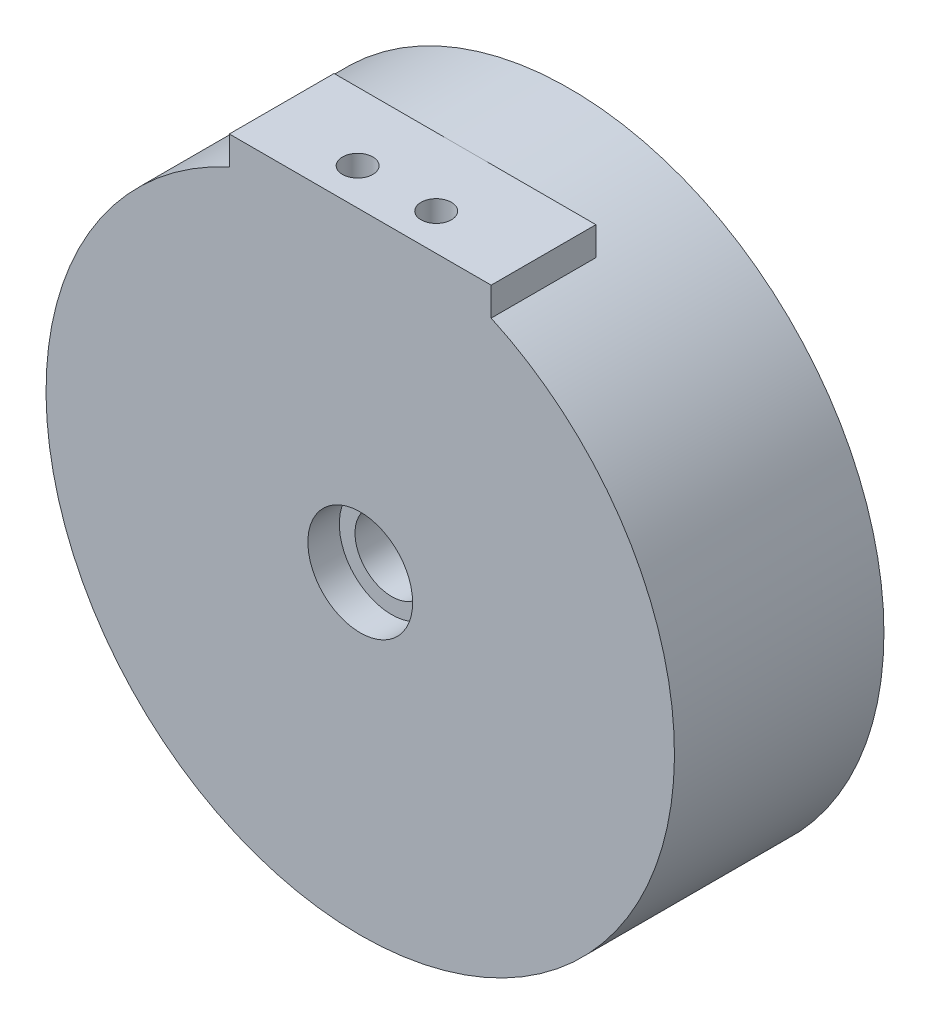
ISO-10303-21;
HEADER;
FILE_DESCRIPTION(('STEP AP214'),'2;1');
FILE_NAME('part.step','',(''),(''),'','','');
FILE_SCHEMA(('AUTOMOTIVE_DESIGN { 1 0 10303 214 1 1 1 1 }'));
ENDSEC;
DATA;
#1=APPLICATION_CONTEXT('core data for automotive mechanical design processes');
#2=APPLICATION_PROTOCOL_DEFINITION('international standard','automotive_design',2000,#1);
#3=PRODUCT_CONTEXT('',#1,'mechanical');
#4=PRODUCT('Part','Part','',(#3));
#5=PRODUCT_RELATED_PRODUCT_CATEGORY('part','',(#4));
#6=PRODUCT_DEFINITION_FORMATION('','',#4);
#7=PRODUCT_DEFINITION_CONTEXT('part definition',#1,'design');
#8=PRODUCT_DEFINITION('design','',#6,#7);
#9=PRODUCT_DEFINITION_SHAPE('','',#8);
#10=(LENGTH_UNIT() NAMED_UNIT(*) SI_UNIT(.MILLI.,.METRE.));
#11=(NAMED_UNIT(*) PLANE_ANGLE_UNIT() SI_UNIT($,.RADIAN.));
#12=(NAMED_UNIT(*) SI_UNIT($,.STERADIAN.) SOLID_ANGLE_UNIT());
#13=UNCERTAINTY_MEASURE_WITH_UNIT(LENGTH_MEASURE(1.E-05),#10,'distance_accuracy_value','');
#14=(GEOMETRIC_REPRESENTATION_CONTEXT(3) GLOBAL_UNCERTAINTY_ASSIGNED_CONTEXT((#13)) GLOBAL_UNIT_ASSIGNED_CONTEXT((#10,
#11,#12)) REPRESENTATION_CONTEXT('',''));
#15=CARTESIAN_POINT('',(0.,0.,0.));
#16=DIRECTION('',(0.,0.,1.));
#17=DIRECTION('',(1.,0.,0.));
#18=AXIS2_PLACEMENT_3D('',#15,#16,#17);
#19=CARTESIAN_POINT('',(0.,0.,0.));
#20=DIRECTION('',(0.,0.,1.));
#21=DIRECTION('',(1.,0.,0.));
#22=AXIS2_PLACEMENT_3D('',#19,#20,#21);
#23=CYLINDRICAL_SURFACE('',#22,3.5);
#24=CARTESIAN_POINT('',(0.,0.,0.));
#25=DIRECTION('',(0.,0.,1.));
#26=DIRECTION('',(1.,0.,0.));
#27=AXIS2_PLACEMENT_3D('',#24,#25,#26);
#28=CIRCLE('',#27,3.5);
#29=CARTESIAN_POINT('',(3.5,0.,0.));
#30=VERTEX_POINT('',#29);
#31=EDGE_CURVE('E232',#30,#30,#28,.T.);
#32=ORIENTED_EDGE('',*,*,#31,.F.);
#33=EDGE_LOOP('',(#32));
#34=FACE_BOUND('',#33,.T.);
#35=CARTESIAN_POINT('',(0.,0.,17.));
#36=DIRECTION('',(0.,0.,1.));
#37=DIRECTION('',(1.,0.,0.));
#38=AXIS2_PLACEMENT_3D('',#35,#36,#37);
#39=CIRCLE('',#38,3.5);
#40=CARTESIAN_POINT('',(3.5,0.,17.));
#41=VERTEX_POINT('',#40);
#42=EDGE_CURVE('E98',#41,#41,#39,.F.);
#43=ORIENTED_EDGE('',*,*,#42,.F.);
#44=EDGE_LOOP('',(#43));
#45=FACE_BOUND('',#44,.T.);
#46=ADVANCED_FACE('F94',(#34,#45),#23,.F.);
#47=CARTESIAN_POINT('',(0.,0.,0.));
#48=DIRECTION('',(0.,0.,1.));
#49=DIRECTION('',(1.,0.,0.));
#50=AXIS2_PLACEMENT_3D('',#47,#48,#49);
#51=PLANE('',#50);
#52=ORIENTED_EDGE('',*,*,#31,.T.);
#53=EDGE_LOOP('',(#52));
#54=FACE_BOUND('',#53,.T.);
#55=CARTESIAN_POINT('',(0.,0.,0.));
#56=DIRECTION('',(0.,0.,1.));
#57=DIRECTION('',(1.,0.,0.));
#58=AXIS2_PLACEMENT_3D('',#55,#56,#57);
#59=CIRCLE('',#58,30.);
#60=CARTESIAN_POINT('',(30.,0.,0.));
#61=VERTEX_POINT('',#60);
#62=EDGE_CURVE('E103',#61,#61,#59,.T.);
#63=ORIENTED_EDGE('',*,*,#62,.F.);
#64=EDGE_LOOP('',(#63));
#65=FACE_BOUND('',#64,.T.);
#66=ADVANCED_FACE('F170',(#54,#65),#51,.F.);
#67=CARTESIAN_POINT('',(0.,30.,10.));
#68=DIRECTION('',(0.,-1.,0.));
#69=DIRECTION('',(0.,0.,-1.));
#70=AXIS2_PLACEMENT_3D('',#67,#68,#69);
#71=PLANE('',#70);
#72=CARTESIAN_POINT('',(-3.75,30.,16.5));
#73=DIRECTION('',(0.,1.,0.));
#74=DIRECTION('',(0.,0.,1.));
#75=AXIS2_PLACEMENT_3D('',#72,#73,#74);
#76=CIRCLE('',#75,1.45);
#77=CARTESIAN_POINT('',(-3.75,30.,17.95));
#78=VERTEX_POINT('',#77);
#79=EDGE_CURVE('E243',#78,#78,#76,.T.);
#80=ORIENTED_EDGE('',*,*,#79,.F.);
#81=EDGE_LOOP('',(#80));
#82=FACE_BOUND('',#81,.T.);
#83=CARTESIAN_POINT('',(3.75,30.,16.5));
#84=DIRECTION('',(0.,1.,0.));
#85=DIRECTION('',(0.,0.,1.));
#86=AXIS2_PLACEMENT_3D('',#83,#84,#85);
#87=CIRCLE('',#86,1.45);
#88=CARTESIAN_POINT('',(3.75,30.,17.95));
#89=VERTEX_POINT('',#88);
#90=EDGE_CURVE('E246',#89,#89,#87,.T.);
#91=ORIENTED_EDGE('',*,*,#90,.F.);
#92=EDGE_LOOP('',(#91));
#93=FACE_BOUND('',#92,.T.);
#94=DIRECTION('',(1.,0.,0.));
#95=VECTOR('',#94,1.);
#96=CARTESIAN_POINT('',(0.,30.,10.));
#97=LINE('',#96,#95);
#98=CARTESIAN_POINT('',(-12.5,30.,10.));
#99=VERTEX_POINT('',#98);
#100=CARTESIAN_POINT('',(0.,30.,10.));
#101=VERTEX_POINT('',#100);
#102=EDGE_CURVE('E142',#99,#101,#97,.T.);
#103=ORIENTED_EDGE('',*,*,#102,.F.);
#104=DIRECTION('',(0.,0.,-1.));
#105=VECTOR('',#104,1.);
#106=CARTESIAN_POINT('',(-12.5,30.,10.));
#107=LINE('',#106,#105);
#108=CARTESIAN_POINT('',(-12.5,30.,20.));
#109=VERTEX_POINT('',#108);
#110=EDGE_CURVE('E149',#109,#99,#107,.T.);
#111=ORIENTED_EDGE('',*,*,#110,.F.);
#112=DIRECTION('',(-1.,0.,0.));
#113=VECTOR('',#112,1.);
#114=CARTESIAN_POINT('',(0.,30.,20.));
#115=LINE('',#114,#113);
#116=CARTESIAN_POINT('',(12.5,30.,20.));
#117=VERTEX_POINT('',#116);
#118=EDGE_CURVE('E259',#117,#109,#115,.T.);
#119=ORIENTED_EDGE('',*,*,#118,.F.);
#120=DIRECTION('',(0.,0.,-1.));
#121=VECTOR('',#120,1.);
#122=CARTESIAN_POINT('',(12.5,30.,10.));
#123=LINE('',#122,#121);
#124=CARTESIAN_POINT('',(12.5,30.,10.));
#125=VERTEX_POINT('',#124);
#126=EDGE_CURVE('E163',#117,#125,#123,.T.);
#127=ORIENTED_EDGE('',*,*,#126,.T.);
#128=DIRECTION('',(1.,0.,0.));
#129=VECTOR('',#128,1.);
#130=CARTESIAN_POINT('',(0.,30.,10.));
#131=LINE('',#130,#129);
#132=EDGE_CURVE('E119',#101,#125,#131,.T.);
#133=ORIENTED_EDGE('',*,*,#132,.F.);
#134=EDGE_LOOP('',(#103,#111,#119,#127,#133));
#135=FACE_BOUND('',#134,.T.);
#136=ADVANCED_FACE('F148',(#82,#93,#135),#71,.F.);
#137=CARTESIAN_POINT('',(-12.5,0.,10.));
#138=DIRECTION('',(1.,0.,0.));
#139=DIRECTION('',(0.,0.,-1.));
#140=AXIS2_PLACEMENT_3D('',#137,#138,#139);
#141=PLANE('',#140);
#142=DIRECTION('',(0.,1.,0.));
#143=VECTOR('',#142,1.);
#144=CARTESIAN_POINT('',(-12.5,0.,10.));
#145=LINE('',#144,#143);
#146=CARTESIAN_POINT('',(-12.5,27.2717802865893,10.));
#147=VERTEX_POINT('',#146);
#148=EDGE_CURVE('E139',#147,#99,#145,.T.);
#149=ORIENTED_EDGE('',*,*,#148,.F.);
#150=DIRECTION('',(0.,0.,-1.));
#151=VECTOR('',#150,1.);
#152=CARTESIAN_POINT('',(-12.5,27.2717802865893,10.));
#153=LINE('',#152,#151);
#154=CARTESIAN_POINT('',(-12.5,27.2717802865893,20.));
#155=VERTEX_POINT('',#154);
#156=EDGE_CURVE('E158',#155,#147,#153,.T.);
#157=ORIENTED_EDGE('',*,*,#156,.F.);
#158=DIRECTION('',(0.,-1.,0.));
#159=VECTOR('',#158,1.);
#160=CARTESIAN_POINT('',(-12.5,0.,20.));
#161=LINE('',#160,#159);
#162=EDGE_CURVE('E156',#109,#155,#161,.T.);
#163=ORIENTED_EDGE('',*,*,#162,.F.);
#164=ORIENTED_EDGE('',*,*,#110,.T.);
#165=EDGE_LOOP('',(#149,#157,#163,#164));
#166=FACE_BOUND('',#165,.T.);
#167=ADVANCED_FACE('F154',(#166),#141,.F.);
#168=CARTESIAN_POINT('',(12.5,0.,10.));
#169=DIRECTION('',(1.,0.,0.));
#170=DIRECTION('',(0.,0.,-1.));
#171=AXIS2_PLACEMENT_3D('',#168,#169,#170);
#172=PLANE('',#171);
#173=DIRECTION('',(0.,0.,-1.));
#174=VECTOR('',#173,1.);
#175=CARTESIAN_POINT('',(12.5,27.2717802865893,10.));
#176=LINE('',#175,#174);
#177=CARTESIAN_POINT('',(12.5,27.2717802865893,20.));
#178=VERTEX_POINT('',#177);
#179=CARTESIAN_POINT('',(12.5,27.2717802865893,10.));
#180=VERTEX_POINT('',#179);
#181=EDGE_CURVE('E159',#178,#180,#176,.T.);
#182=ORIENTED_EDGE('',*,*,#181,.T.);
#183=DIRECTION('',(0.,-1.,0.));
#184=VECTOR('',#183,1.);
#185=CARTESIAN_POINT('',(12.5,0.,10.));
#186=LINE('',#185,#184);
#187=EDGE_CURVE('E152',#125,#180,#186,.T.);
#188=ORIENTED_EDGE('',*,*,#187,.F.);
#189=ORIENTED_EDGE('',*,*,#126,.F.);
#190=DIRECTION('',(0.,-1.,0.));
#191=VECTOR('',#190,1.);
#192=CARTESIAN_POINT('',(12.5,0.,20.));
#193=LINE('',#192,#191);
#194=EDGE_CURVE('E256',#117,#178,#193,.T.);
#195=ORIENTED_EDGE('',*,*,#194,.T.);
#196=EDGE_LOOP('',(#182,#188,#189,#195));
#197=FACE_BOUND('',#196,.T.);
#198=ADVANCED_FACE('F191',(#197),#172,.T.);
#199=CARTESIAN_POINT('',(0.,0.,20.));
#200=DIRECTION('',(0.,0.,-1.));
#201=DIRECTION('',(-1.,0.,0.));
#202=AXIS2_PLACEMENT_3D('',#199,#200,#201);
#203=CYLINDRICAL_SURFACE('',#202,30.);
#204=ORIENTED_EDGE('',*,*,#62,.T.);
#205=EDGE_LOOP('',(#204));
#206=FACE_BOUND('',#205,.T.);
#207=ORIENTED_EDGE('',*,*,#181,.F.);
#208=CARTESIAN_POINT('',(0.,0.,20.));
#209=DIRECTION('',(0.,0.,1.));
#210=DIRECTION('',(1.,0.,0.));
#211=AXIS2_PLACEMENT_3D('',#208,#209,#210);
#212=CIRCLE('',#211,30.);
#213=EDGE_CURVE('E12',#155,#178,#212,.T.);
#214=ORIENTED_EDGE('',*,*,#213,.F.);
#215=ORIENTED_EDGE('',*,*,#156,.T.);
#216=CARTESIAN_POINT('',(0.,0.,10.));
#217=DIRECTION('',(0.,0.,-1.));
#218=DIRECTION('',(-1.,0.,0.));
#219=AXIS2_PLACEMENT_3D('',#216,#217,#218);
#220=CIRCLE('',#219,30.);
#221=EDGE_CURVE('E111',#147,#101,#220,.T.);
#222=ORIENTED_EDGE('',*,*,#221,.T.);
#223=CARTESIAN_POINT('',(0.,0.,10.));
#224=DIRECTION('',(0.,0.,-1.));
#225=DIRECTION('',(-1.,0.,0.));
#226=AXIS2_PLACEMENT_3D('',#223,#224,#225);
#227=CIRCLE('',#226,30.);
#228=EDGE_CURVE('E253',#180,#101,#227,.F.);
#229=ORIENTED_EDGE('',*,*,#228,.F.);
#230=EDGE_LOOP('',(#207,#214,#215,#222,#229));
#231=FACE_BOUND('',#230,.T.);
#232=ADVANCED_FACE('F96',(#206,#231),#203,.T.);
#233=CARTESIAN_POINT('',(0.,0.,20.));
#234=DIRECTION('',(0.,0.,1.));
#235=DIRECTION('',(1.,0.,0.));
#236=AXIS2_PLACEMENT_3D('',#233,#234,#235);
#237=PLANE('',#236);
#238=CARTESIAN_POINT('',(0.,0.,20.));
#239=DIRECTION('',(0.,0.,1.));
#240=DIRECTION('',(1.,0.,0.));
#241=AXIS2_PLACEMENT_3D('',#238,#239,#240);
#242=CIRCLE('',#241,5.);
#243=CARTESIAN_POINT('',(5.,0.,20.));
#244=VERTEX_POINT('',#243);
#245=EDGE_CURVE('E235',#244,#244,#242,.T.);
#246=ORIENTED_EDGE('',*,*,#245,.F.);
#247=EDGE_LOOP('',(#246));
#248=FACE_BOUND('',#247,.T.);
#249=ORIENTED_EDGE('',*,*,#213,.T.);
#250=ORIENTED_EDGE('',*,*,#194,.F.);
#251=ORIENTED_EDGE('',*,*,#118,.T.);
#252=ORIENTED_EDGE('',*,*,#162,.T.);
#253=EDGE_LOOP('',(#249,#250,#251,#252));
#254=FACE_BOUND('',#253,.T.);
#255=ADVANCED_FACE('F185',(#248,#254),#237,.T.);
#256=CARTESIAN_POINT('',(0.,0.,10.));
#257=DIRECTION('',(0.,0.,-1.));
#258=DIRECTION('',(-1.,0.,0.));
#259=AXIS2_PLACEMENT_3D('',#256,#257,#258);
#260=PLANE('',#259);
#261=ORIENTED_EDGE('',*,*,#187,.T.);
#262=ORIENTED_EDGE('',*,*,#228,.T.);
#263=ORIENTED_EDGE('',*,*,#132,.T.);
#264=EDGE_LOOP('',(#261,#262,#263));
#265=FACE_BOUND('',#264,.T.);
#266=ADVANCED_FACE('F188',(#265),#260,.T.);
#267=CARTESIAN_POINT('',(0.,0.,10.));
#268=DIRECTION('',(0.,0.,-1.));
#269=DIRECTION('',(-1.,0.,0.));
#270=AXIS2_PLACEMENT_3D('',#267,#268,#269);
#271=PLANE('',#270);
#272=ORIENTED_EDGE('',*,*,#221,.F.);
#273=ORIENTED_EDGE('',*,*,#148,.T.);
#274=ORIENTED_EDGE('',*,*,#102,.T.);
#275=EDGE_LOOP('',(#272,#273,#274));
#276=FACE_BOUND('',#275,.T.);
#277=ADVANCED_FACE('F141',(#276),#271,.T.);
#278=CARTESIAN_POINT('',(3.75,27.,16.5));
#279=DIRECTION('',(0.,1.,0.));
#280=DIRECTION('',(0.,0.,1.));
#281=AXIS2_PLACEMENT_3D('',#278,#279,#280);
#282=CYLINDRICAL_SURFACE('',#281,1.45);
#283=CARTESIAN_POINT('',(3.75,27.,16.5));
#284=DIRECTION('',(0.,1.,0.));
#285=DIRECTION('',(0.,0.,1.));
#286=AXIS2_PLACEMENT_3D('',#283,#284,#285);
#287=CIRCLE('',#286,1.45);
#288=CARTESIAN_POINT('',(3.75,27.,17.95));
#289=VERTEX_POINT('',#288);
#290=EDGE_CURVE('E233',#289,#289,#287,.T.);
#291=ORIENTED_EDGE('',*,*,#290,.F.);
#292=EDGE_LOOP('',(#291));
#293=FACE_BOUND('',#292,.T.);
#294=ORIENTED_EDGE('',*,*,#90,.T.);
#295=EDGE_LOOP('',(#294));
#296=FACE_BOUND('',#295,.T.);
#297=ADVANCED_FACE('F200',(#293,#296),#282,.F.);
#298=CARTESIAN_POINT('',(0.,27.,0.));
#299=DIRECTION('',(0.,1.,0.));
#300=DIRECTION('',(0.,0.,1.));
#301=AXIS2_PLACEMENT_3D('',#298,#299,#300);
#302=PLANE('',#301);
#303=ORIENTED_EDGE('',*,*,#290,.T.);
#304=EDGE_LOOP('',(#303));
#305=FACE_BOUND('',#304,.T.);
#306=ADVANCED_FACE('F201',(#305),#302,.T.);
#307=CARTESIAN_POINT('',(-3.75,27.,16.5));
#308=DIRECTION('',(0.,1.,0.));
#309=DIRECTION('',(0.,0.,1.));
#310=AXIS2_PLACEMENT_3D('',#307,#308,#309);
#311=CYLINDRICAL_SURFACE('',#310,1.45);
#312=CARTESIAN_POINT('',(-3.75,27.,16.5));
#313=DIRECTION('',(0.,1.,0.));
#314=DIRECTION('',(0.,0.,1.));
#315=AXIS2_PLACEMENT_3D('',#312,#313,#314);
#316=CIRCLE('',#315,1.45);
#317=CARTESIAN_POINT('',(-3.75,27.,17.95));
#318=VERTEX_POINT('',#317);
#319=EDGE_CURVE('E240',#318,#318,#316,.T.);
#320=ORIENTED_EDGE('',*,*,#319,.F.);
#321=EDGE_LOOP('',(#320));
#322=FACE_BOUND('',#321,.T.);
#323=ORIENTED_EDGE('',*,*,#79,.T.);
#324=EDGE_LOOP('',(#323));
#325=FACE_BOUND('',#324,.T.);
#326=ADVANCED_FACE('F204',(#322,#325),#311,.F.);
#327=CARTESIAN_POINT('',(0.,27.,0.));
#328=DIRECTION('',(0.,1.,0.));
#329=DIRECTION('',(0.,0.,1.));
#330=AXIS2_PLACEMENT_3D('',#327,#328,#329);
#331=PLANE('',#330);
#332=ORIENTED_EDGE('',*,*,#319,.T.);
#333=EDGE_LOOP('',(#332));
#334=FACE_BOUND('',#333,.T.);
#335=ADVANCED_FACE('F211',(#334),#331,.T.);
#336=CARTESIAN_POINT('',(0.,0.,17.));
#337=DIRECTION('',(0.,0.,1.));
#338=DIRECTION('',(1.,0.,0.));
#339=AXIS2_PLACEMENT_3D('',#336,#337,#338);
#340=PLANE('',#339);
#341=CARTESIAN_POINT('',(0.,0.,17.));
#342=DIRECTION('',(0.,0.,1.));
#343=DIRECTION('',(1.,0.,0.));
#344=AXIS2_PLACEMENT_3D('',#341,#342,#343);
#345=CIRCLE('',#344,5.);
#346=CARTESIAN_POINT('',(5.,0.,17.));
#347=VERTEX_POINT('',#346);
#348=EDGE_CURVE('E228',#347,#347,#345,.T.);
#349=ORIENTED_EDGE('',*,*,#348,.T.);
#350=EDGE_LOOP('',(#349));
#351=FACE_BOUND('',#350,.T.);
#352=ORIENTED_EDGE('',*,*,#42,.T.);
#353=EDGE_LOOP('',(#352));
#354=FACE_BOUND('',#353,.T.);
#355=ADVANCED_FACE('F214',(#351,#354),#340,.T.);
#356=CARTESIAN_POINT('',(0.,0.,17.));
#357=DIRECTION('',(0.,0.,1.));
#358=DIRECTION('',(1.,0.,0.));
#359=AXIS2_PLACEMENT_3D('',#356,#357,#358);
#360=CYLINDRICAL_SURFACE('',#359,5.);
#361=ORIENTED_EDGE('',*,*,#348,.F.);
#362=EDGE_LOOP('',(#361));
#363=FACE_BOUND('',#362,.T.);
#364=ORIENTED_EDGE('',*,*,#245,.T.);
#365=EDGE_LOOP('',(#364));
#366=FACE_BOUND('',#365,.T.);
#367=ADVANCED_FACE('F217',(#363,#366),#360,.F.);
#368=CLOSED_SHELL('',(#46,#66,#136,#167,#198,#232,#255,#266,#277,#297,#306,#326,#335,#355,#367));
#369=MANIFOLD_SOLID_BREP('B2',#368);
#370=ADVANCED_BREP_SHAPE_REPRESENTATION('',(#18,#369),#14);
#371=SHAPE_DEFINITION_REPRESENTATION(#9,#370);
ENDSEC;
END-ISO-10303-21;
